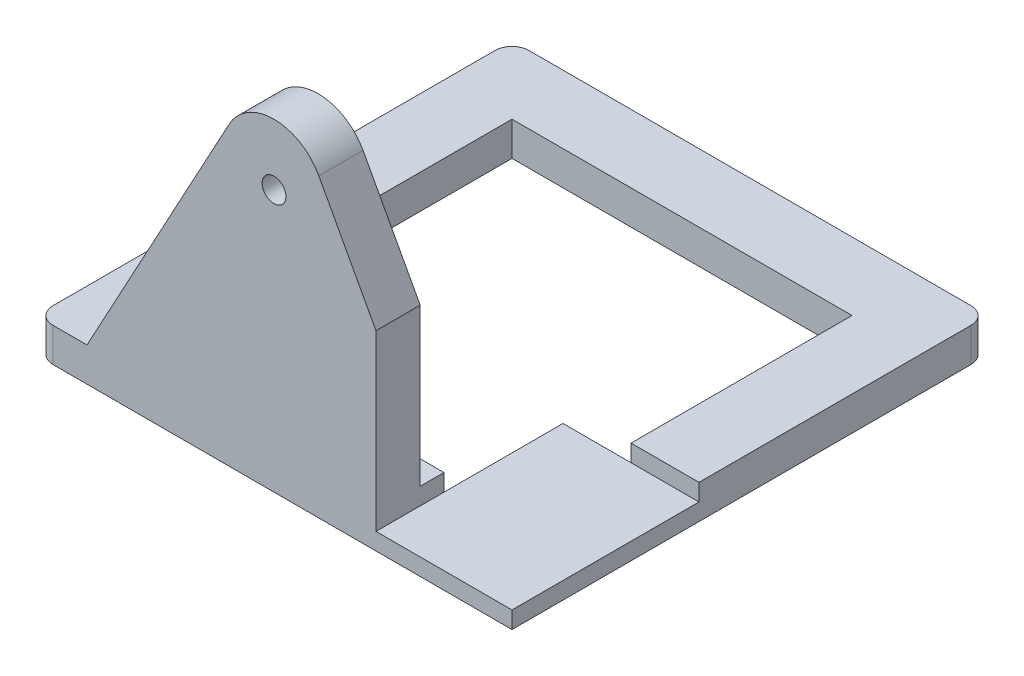
ISO-10303-21;
HEADER;
FILE_DESCRIPTION(('STEP AP214'),'2;1');
FILE_NAME('part.step','',(''),(''),'','','');
FILE_SCHEMA(('AUTOMOTIVE_DESIGN { 1 0 10303 214 1 1 1 1 }'));
ENDSEC;
DATA;
#1=APPLICATION_CONTEXT('core data for automotive mechanical design processes');
#2=APPLICATION_PROTOCOL_DEFINITION('international standard','automotive_design',2000,#1);
#3=PRODUCT_CONTEXT('',#1,'mechanical');
#4=PRODUCT('Part','Part','',(#3));
#5=PRODUCT_RELATED_PRODUCT_CATEGORY('part','',(#4));
#6=PRODUCT_DEFINITION_FORMATION('','',#4);
#7=PRODUCT_DEFINITION_CONTEXT('part definition',#1,'design');
#8=PRODUCT_DEFINITION('design','',#6,#7);
#9=PRODUCT_DEFINITION_SHAPE('','',#8);
#10=(LENGTH_UNIT() NAMED_UNIT(*) SI_UNIT(.MILLI.,.METRE.));
#11=(NAMED_UNIT(*) PLANE_ANGLE_UNIT() SI_UNIT($,.RADIAN.));
#12=(NAMED_UNIT(*) SI_UNIT($,.STERADIAN.) SOLID_ANGLE_UNIT());
#13=UNCERTAINTY_MEASURE_WITH_UNIT(LENGTH_MEASURE(1.E-05),#10,'distance_accuracy_value','');
#14=(GEOMETRIC_REPRESENTATION_CONTEXT(3) GLOBAL_UNCERTAINTY_ASSIGNED_CONTEXT((#13)) GLOBAL_UNIT_ASSIGNED_CONTEXT((#10,
#11,#12)) REPRESENTATION_CONTEXT('',''));
#15=CARTESIAN_POINT('',(0.,0.,0.));
#16=DIRECTION('',(0.,0.,1.));
#17=DIRECTION('',(1.,0.,0.));
#18=AXIS2_PLACEMENT_3D('',#15,#16,#17);
#19=CARTESIAN_POINT('',(49.9999999999994,10.,49.9999999999998));
#20=DIRECTION('',(-1.,0.,0.));
#21=DIRECTION('',(0.,0.,1.));
#22=AXIS2_PLACEMENT_3D('',#19,#20,#21);
#23=PLANE('',#22);
#24=DIRECTION('',(0.,0.,-1.));
#25=VECTOR('',#24,1.);
#26=CARTESIAN_POINT('',(49.9999999999994,0.,49.9999999999998));
#27=LINE('',#26,#25);
#28=CARTESIAN_POINT('',(49.9999999999994,0.,14.9999999999998));
#29=VERTEX_POINT('',#28);
#30=CARTESIAN_POINT('',(49.9999999999994,0.,-50.0000000000003));
#31=VERTEX_POINT('',#30);
#32=EDGE_CURVE('E278',#29,#31,#27,.T.);
#33=ORIENTED_EDGE('',*,*,#32,.F.);
#34=DIRECTION('',(0.,1.,0.));
#35=VECTOR('',#34,1.);
#36=CARTESIAN_POINT('',(49.9999999999994,10.,14.9999999999998));
#37=LINE('',#36,#35);
#38=CARTESIAN_POINT('',(49.9999999999994,5.,14.9999999999998));
#39=VERTEX_POINT('',#38);
#40=EDGE_CURVE('E215',#29,#39,#37,.T.);
#41=ORIENTED_EDGE('',*,*,#40,.T.);
#42=DIRECTION('',(0.,1.,0.));
#43=VECTOR('',#42,1.);
#44=CARTESIAN_POINT('',(49.9999999999994,10.,14.9999999999998));
#45=LINE('',#44,#43);
#46=CARTESIAN_POINT('',(49.9999999999994,10.,14.9999999999998));
#47=VERTEX_POINT('',#46);
#48=EDGE_CURVE('E11',#39,#47,#45,.T.);
#49=ORIENTED_EDGE('',*,*,#48,.T.);
#50=DIRECTION('',(0.,0.,-1.));
#51=VECTOR('',#50,1.);
#52=CARTESIAN_POINT('',(49.9999999999994,10.,49.9999999999998));
#53=LINE('',#52,#51);
#54=CARTESIAN_POINT('',(49.9999999999994,10.,-50.0000000000003));
#55=VERTEX_POINT('',#54);
#56=EDGE_CURVE('E279',#47,#55,#53,.T.);
#57=ORIENTED_EDGE('',*,*,#56,.T.);
#58=DIRECTION('',(0.,-1.,0.));
#59=VECTOR('',#58,1.);
#60=CARTESIAN_POINT('',(49.9999999999994,10.,-50.0000000000003));
#61=LINE('',#60,#59);
#62=EDGE_CURVE('E196',#55,#31,#61,.T.);
#63=ORIENTED_EDGE('',*,*,#62,.T.);
#64=EDGE_LOOP('',(#33,#41,#49,#57,#63));
#65=FACE_BOUND('',#64,.T.);
#66=ADVANCED_FACE('F33',(#65),#23,.T.);
#67=CARTESIAN_POINT('',(-50.0000000000007,10.,49.9999999999998));
#68=DIRECTION('',(0.,0.,-1.));
#69=DIRECTION('',(-1.,0.,0.));
#70=AXIS2_PLACEMENT_3D('',#67,#68,#69);
#71=PLANE('',#70);
#72=DIRECTION('',(0.,-1.,0.));
#73=VECTOR('',#72,1.);
#74=CARTESIAN_POINT('',(29.9999999999996,10.,49.9999999999998));
#75=LINE('',#74,#73);
#76=CARTESIAN_POINT('',(29.9999999999996,10.,49.9999999999998));
#77=VERTEX_POINT('',#76);
#78=CARTESIAN_POINT('',(29.9999999999996,5.,49.9999999999998));
#79=VERTEX_POINT('',#78);
#80=EDGE_CURVE('E236',#77,#79,#75,.T.);
#81=ORIENTED_EDGE('',*,*,#80,.T.);
#82=DIRECTION('',(0.,-1.,0.));
#83=VECTOR('',#82,1.);
#84=CARTESIAN_POINT('',(29.9999999999996,10.,49.9999999999998));
#85=LINE('',#84,#83);
#86=CARTESIAN_POINT('',(29.9999999999996,0.,49.9999999999998));
#87=VERTEX_POINT('',#86);
#88=EDGE_CURVE('E212',#79,#87,#85,.T.);
#89=ORIENTED_EDGE('',*,*,#88,.T.);
#90=DIRECTION('',(1.,0.,0.));
#91=VECTOR('',#90,1.);
#92=CARTESIAN_POINT('',(-50.0000000000007,0.,49.9999999999998));
#93=LINE('',#92,#91);
#94=CARTESIAN_POINT('',(-50.0000000000007,0.,49.9999999999998));
#95=VERTEX_POINT('',#94);
#96=EDGE_CURVE('E282',#95,#87,#93,.T.);
#97=ORIENTED_EDGE('',*,*,#96,.F.);
#98=DIRECTION('',(0.,-1.,0.));
#99=VECTOR('',#98,1.);
#100=CARTESIAN_POINT('',(-50.0000000000007,10.,49.9999999999998));
#101=LINE('',#100,#99);
#102=CARTESIAN_POINT('',(-50.0000000000007,10.,49.9999999999998));
#103=VERTEX_POINT('',#102);
#104=EDGE_CURVE('E290',#103,#95,#101,.T.);
#105=ORIENTED_EDGE('',*,*,#104,.F.);
#106=DIRECTION('',(1.,0.,0.));
#107=VECTOR('',#106,1.);
#108=CARTESIAN_POINT('',(-50.0000000000007,10.,49.9999999999998));
#109=LINE('',#108,#107);
#110=EDGE_CURVE('E287',#103,#77,#109,.T.);
#111=ORIENTED_EDGE('',*,*,#110,.T.);
#112=EDGE_LOOP('',(#81,#89,#97,#105,#111));
#113=FACE_BOUND('',#112,.T.);
#114=ADVANCED_FACE('F404',(#113),#71,.T.);
#115=CARTESIAN_POINT('',(0.,10.,0.));
#116=DIRECTION('',(0.,-1.,0.));
#117=DIRECTION('',(0.,0.,-1.));
#118=AXIS2_PLACEMENT_3D('',#115,#116,#117);
#119=PLANE('',#118);
#120=DIRECTION('',(0.,0.,1.));
#121=VECTOR('',#120,1.);
#122=CARTESIAN_POINT('',(29.9999999999996,10.,0.));
#123=LINE('',#122,#121);
#124=CARTESIAN_POINT('',(29.9999999999996,9.99999999999998,56.9999999999998));
#125=VERTEX_POINT('',#124);
#126=EDGE_CURVE('E234',#77,#125,#123,.T.);
#127=ORIENTED_EDGE('',*,*,#126,.F.);
#128=ORIENTED_EDGE('',*,*,#110,.F.);
#129=DIRECTION('',(0.,0.,1.));
#130=VECTOR('',#129,1.);
#131=CARTESIAN_POINT('',(-50.0000000000007,10.,49.9999999999998));
#132=LINE('',#131,#130);
#133=CARTESIAN_POINT('',(-50.0000000000007,10.,-50.0000000000003));
#134=VERTEX_POINT('',#133);
#135=EDGE_CURVE('E284',#134,#103,#132,.T.);
#136=ORIENTED_EDGE('',*,*,#135,.F.);
#137=DIRECTION('',(-1.,0.,0.));
#138=VECTOR('',#137,1.);
#139=CARTESIAN_POINT('',(-50.0000000000007,10.,-50.0000000000003));
#140=LINE('',#139,#138);
#141=EDGE_CURVE('E281',#55,#134,#140,.T.);
#142=ORIENTED_EDGE('',*,*,#141,.F.);
#143=ORIENTED_EDGE('',*,*,#56,.F.);
#144=DIRECTION('',(-1.,0.,0.));
#145=VECTOR('',#144,1.);
#146=CARTESIAN_POINT('',(0.,10.,14.9999999999998));
#147=LINE('',#146,#145);
#148=CARTESIAN_POINT('',(69.9999999999996,10.,14.9999999999998));
#149=VERTEX_POINT('',#148);
#150=EDGE_CURVE('E239',#149,#47,#147,.T.);
#151=ORIENTED_EDGE('',*,*,#150,.F.);
#152=DIRECTION('',(0.,0.,-1.));
#153=VECTOR('',#152,1.);
#154=CARTESIAN_POINT('',(69.9999999999996,10.,69.9999999999998));
#155=LINE('',#154,#153);
#156=CARTESIAN_POINT('',(69.9999999999996,10.,-65.0000000000002));
#157=VERTEX_POINT('',#156);
#158=EDGE_CURVE('E184',#149,#157,#155,.T.);
#159=ORIENTED_EDGE('',*,*,#158,.T.);
#160=CARTESIAN_POINT('',(64.9999999999996,10.,-65.0000000000002));
#161=DIRECTION('',(0.,-1.,0.));
#162=DIRECTION('',(0.,0.,-1.));
#163=AXIS2_PLACEMENT_3D('',#160,#161,#162);
#164=CIRCLE('',#163,5.);
#165=CARTESIAN_POINT('',(64.9999999999996,10.,-70.0000000000002));
#166=VERTEX_POINT('',#165);
#167=EDGE_CURVE('E330',#157,#166,#164,.F.);
#168=ORIENTED_EDGE('',*,*,#167,.T.);
#169=DIRECTION('',(-1.,0.,0.));
#170=VECTOR('',#169,1.);
#171=CARTESIAN_POINT('',(-70.0000000000005,10.,-70.0000000000002));
#172=LINE('',#171,#170);
#173=CARTESIAN_POINT('',(-65.0000000000005,10.,-70.0000000000002));
#174=VERTEX_POINT('',#173);
#175=EDGE_CURVE('E306',#166,#174,#172,.T.);
#176=ORIENTED_EDGE('',*,*,#175,.T.);
#177=CARTESIAN_POINT('',(-65.0000000000005,10.,-65.0000000000002));
#178=DIRECTION('',(0.,-1.,0.));
#179=DIRECTION('',(0.,0.,-1.));
#180=AXIS2_PLACEMENT_3D('',#177,#178,#179);
#181=CIRCLE('',#180,5.);
#182=CARTESIAN_POINT('',(-70.0000000000005,10.,-65.0000000000002));
#183=VERTEX_POINT('',#182);
#184=EDGE_CURVE('E55',#174,#183,#181,.F.);
#185=ORIENTED_EDGE('',*,*,#184,.T.);
#186=DIRECTION('',(0.,0.,1.));
#187=VECTOR('',#186,1.);
#188=CARTESIAN_POINT('',(-70.0000000000005,10.,69.9999999999998));
#189=LINE('',#188,#187);
#190=CARTESIAN_POINT('',(-70.0000000000005,10.,64.9999999999998));
#191=VERTEX_POINT('',#190);
#192=EDGE_CURVE('E308',#183,#191,#189,.T.);
#193=ORIENTED_EDGE('',*,*,#192,.T.);
#194=CARTESIAN_POINT('',(-65.0000000000005,10.,64.9999999999998));
#195=DIRECTION('',(0.,-1.,0.));
#196=DIRECTION('',(0.,0.,-1.));
#197=AXIS2_PLACEMENT_3D('',#194,#195,#196);
#198=CIRCLE('',#197,5.);
#199=CARTESIAN_POINT('',(-65.0000000000005,10.,69.9999999999998));
#200=VERTEX_POINT('',#199);
#201=EDGE_CURVE('E328',#191,#200,#198,.F.);
#202=ORIENTED_EDGE('',*,*,#201,.T.);
#203=DIRECTION('',(1.,0.,0.));
#204=VECTOR('',#203,1.);
#205=CARTESIAN_POINT('',(-70.0000000000005,10.,69.9999999999998));
#206=LINE('',#205,#204);
#207=CARTESIAN_POINT('',(-55.,10.,69.9999999999998));
#208=VERTEX_POINT('',#207);
#209=EDGE_CURVE('E310',#200,#208,#206,.T.);
#210=ORIENTED_EDGE('',*,*,#209,.T.);
#211=DIRECTION('',(0.,0.,-1.));
#212=VECTOR('',#211,1.);
#213=CARTESIAN_POINT('',(-55.,9.99999999999998,209.014387744578));
#214=LINE('',#213,#212);
#215=CARTESIAN_POINT('',(-55.,9.99999999999998,56.9999999999998));
#216=VERTEX_POINT('',#215);
#217=EDGE_CURVE('E268',#208,#216,#214,.T.);
#218=ORIENTED_EDGE('',*,*,#217,.T.);
#219=DIRECTION('',(-1.,0.,0.));
#220=VECTOR('',#219,1.);
#221=CARTESIAN_POINT('',(-55.,9.99999999999998,56.9999999999998));
#222=LINE('',#221,#220);
#223=EDGE_CURVE('E262',#125,#216,#222,.T.);
#224=ORIENTED_EDGE('',*,*,#223,.F.);
#225=EDGE_LOOP('',(#127,#128,#136,#142,#143,#151,#159,#168,#176,#185,#193,#202,#210,#218,#224));
#226=FACE_BOUND('',#225,.T.);
#227=ADVANCED_FACE('F359',(#226),#119,.F.);
#228=CARTESIAN_POINT('',(69.9999999999996,10.,69.9999999999998));
#229=DIRECTION('',(-1.,0.,0.));
#230=DIRECTION('',(0.,0.,1.));
#231=AXIS2_PLACEMENT_3D('',#228,#229,#230);
#232=PLANE('',#231);
#233=DIRECTION('',(0.,0.,-1.));
#234=VECTOR('',#233,1.);
#235=CARTESIAN_POINT('',(69.9999999999996,0.,69.9999999999998));
#236=LINE('',#235,#234);
#237=CARTESIAN_POINT('',(69.9999999999996,0.,69.9999999999998));
#238=VERTEX_POINT('',#237);
#239=CARTESIAN_POINT('',(69.9999999999996,0.,-65.0000000000002));
#240=VERTEX_POINT('',#239);
#241=EDGE_CURVE('E188',#238,#240,#236,.T.);
#242=ORIENTED_EDGE('',*,*,#241,.T.);
#243=DIRECTION('',(0.,-1.,0.));
#244=VECTOR('',#243,1.);
#245=CARTESIAN_POINT('',(69.9999999999996,10.,-65.0000000000002));
#246=LINE('',#245,#244);
#247=EDGE_CURVE('E325',#240,#157,#246,.F.);
#248=ORIENTED_EDGE('',*,*,#247,.T.);
#249=ORIENTED_EDGE('',*,*,#158,.F.);
#250=DIRECTION('',(0.,-1.,0.));
#251=VECTOR('',#250,1.);
#252=CARTESIAN_POINT('',(69.9999999999996,95.,14.9999999999998));
#253=LINE('',#252,#251);
#254=CARTESIAN_POINT('',(69.9999999999996,5.,14.9999999999998));
#255=VERTEX_POINT('',#254);
#256=EDGE_CURVE('E227',#149,#255,#253,.T.);
#257=ORIENTED_EDGE('',*,*,#256,.T.);
#258=DIRECTION('',(0.,0.,-1.));
#259=VECTOR('',#258,1.);
#260=CARTESIAN_POINT('',(69.9999999999996,5.,69.9999999999998));
#261=LINE('',#260,#259);
#262=CARTESIAN_POINT('',(69.9999999999996,5.,69.9999999999998));
#263=VERTEX_POINT('',#262);
#264=EDGE_CURVE('E200',#263,#255,#261,.T.);
#265=ORIENTED_EDGE('',*,*,#264,.F.);
#266=DIRECTION('',(0.,-1.,0.));
#267=VECTOR('',#266,1.);
#268=CARTESIAN_POINT('',(69.9999999999996,73.0073525436772,69.9999999999998));
#269=LINE('',#268,#267);
#270=EDGE_CURVE('E179',#263,#238,#269,.T.);
#271=ORIENTED_EDGE('',*,*,#270,.T.);
#272=EDGE_LOOP('',(#242,#248,#249,#257,#265,#271));
#273=FACE_BOUND('',#272,.T.);
#274=ADVANCED_FACE('F198',(#273),#232,.F.);
#275=CARTESIAN_POINT('',(-70.0000000000005,10.,69.9999999999998));
#276=DIRECTION('',(0.,0.,-1.));
#277=DIRECTION('',(-1.,0.,0.));
#278=AXIS2_PLACEMENT_3D('',#275,#276,#277);
#279=PLANE('',#278);
#280=DIRECTION('',(1.,0.,0.));
#281=VECTOR('',#280,1.);
#282=CARTESIAN_POINT('',(29.9999999999996,5.,69.9999999999998));
#283=LINE('',#282,#281);
#284=CARTESIAN_POINT('',(29.9999999999996,5.,69.9999999999998));
#285=VERTEX_POINT('',#284);
#286=EDGE_CURVE('E221',#285,#263,#283,.T.);
#287=ORIENTED_EDGE('',*,*,#286,.F.);
#288=DIRECTION('',(0.,-1.,0.));
#289=VECTOR('',#288,1.);
#290=CARTESIAN_POINT('',(29.9999999999996,95.,69.9999999999998));
#291=LINE('',#290,#289);
#292=CARTESIAN_POINT('',(29.9999999999996,56.127184447401,69.9999999999998));
#293=VERTEX_POINT('',#292);
#294=EDGE_CURVE('E229',#293,#285,#291,.T.);
#295=ORIENTED_EDGE('',*,*,#294,.F.);
#296=DIRECTION('',(-0.476495951175479,0.879176665132427,0.));
#297=VECTOR('',#296,1.);
#298=CARTESIAN_POINT('',(55.,9.99999999999998,69.9999999999998));
#299=LINE('',#298,#297);
#300=CARTESIAN_POINT('',(13.1876499769864,87.1474392676322,69.9999999999998));
#301=VERTEX_POINT('',#300);
#302=EDGE_CURVE('E265',#293,#301,#299,.T.);
#303=ORIENTED_EDGE('',*,*,#302,.T.);
#304=CARTESIAN_POINT('',(0.,80.,69.9999999999998));
#305=DIRECTION('',(0.,0.,-1.));
#306=DIRECTION('',(-1.,0.,0.));
#307=AXIS2_PLACEMENT_3D('',#304,#305,#306);
#308=CIRCLE('',#307,15.);
#309=CARTESIAN_POINT('',(-13.1876499769864,87.1474392676322,69.9999999999998));
#310=VERTEX_POINT('',#309);
#311=EDGE_CURVE('E271',#301,#310,#308,.F.);
#312=ORIENTED_EDGE('',*,*,#311,.T.);
#313=DIRECTION('',(-0.476495951175479,-0.879176665132427,0.));
#314=VECTOR('',#313,1.);
#315=CARTESIAN_POINT('',(-55.,9.99999999999998,69.9999999999998));
#316=LINE('',#315,#314);
#317=EDGE_CURVE('E267',#310,#208,#316,.T.);
#318=ORIENTED_EDGE('',*,*,#317,.T.);
#319=ORIENTED_EDGE('',*,*,#209,.F.);
#320=DIRECTION('',(0.,-1.,0.));
#321=VECTOR('',#320,1.);
#322=CARTESIAN_POINT('',(-65.0000000000005,10.,69.9999999999998));
#323=LINE('',#322,#321);
#324=CARTESIAN_POINT('',(-65.0000000000005,0.,69.9999999999998));
#325=VERTEX_POINT('',#324);
#326=EDGE_CURVE('E182',#200,#325,#323,.T.);
#327=ORIENTED_EDGE('',*,*,#326,.T.);
#328=DIRECTION('',(1.,0.,0.));
#329=VECTOR('',#328,1.);
#330=CARTESIAN_POINT('',(-70.0000000000005,0.,69.9999999999998));
#331=LINE('',#330,#329);
#332=EDGE_CURVE('E173',#325,#238,#331,.T.);
#333=ORIENTED_EDGE('',*,*,#332,.T.);
#334=ORIENTED_EDGE('',*,*,#270,.F.);
#335=EDGE_LOOP('',(#287,#295,#303,#312,#318,#319,#327,#333,#334));
#336=FACE_BOUND('',#335,.T.);
#337=CARTESIAN_POINT('',(0.,77.,69.9999999999998));
#338=DIRECTION('',(0.,0.,-1.));
#339=DIRECTION('',(-1.,0.,0.));
#340=AXIS2_PLACEMENT_3D('',#337,#338,#339);
#341=CIRCLE('',#340,3.5);
#342=CARTESIAN_POINT('',(-3.5,77.,69.9999999999998));
#343=VERTEX_POINT('',#342);
#344=EDGE_CURVE('E242',#343,#343,#341,.T.);
#345=ORIENTED_EDGE('',*,*,#344,.T.);
#346=EDGE_LOOP('',(#345));
#347=FACE_BOUND('',#346,.T.);
#348=ADVANCED_FACE('F176',(#336,#347),#279,.F.);
#349=CARTESIAN_POINT('',(55.,9.99999999999998,209.014387744578));
#350=DIRECTION('',(0.879176665132427,0.476495951175478,0.));
#351=DIRECTION('',(-0.476495951175479,0.879176665132427,0.));
#352=AXIS2_PLACEMENT_3D('',#349,#350,#351);
#353=PLANE('',#352);
#354=ORIENTED_EDGE('',*,*,#302,.F.);
#355=DIRECTION('',(0.,0.,-1.));
#356=VECTOR('',#355,1.);
#357=CARTESIAN_POINT('',(29.9999999999996,56.1271844474009,209.014387744578));
#358=LINE('',#357,#356);
#359=CARTESIAN_POINT('',(29.9999999999996,56.1271844474009,56.9999999999998));
#360=VERTEX_POINT('',#359);
#361=EDGE_CURVE('E231',#293,#360,#358,.T.);
#362=ORIENTED_EDGE('',*,*,#361,.T.);
#363=DIRECTION('',(0.476495951175479,-0.879176665132427,0.));
#364=VECTOR('',#363,1.);
#365=CARTESIAN_POINT('',(55.,9.99999999999998,56.9999999999998));
#366=LINE('',#365,#364);
#367=CARTESIAN_POINT('',(13.1876499769864,87.1474392676322,56.9999999999998));
#368=VERTEX_POINT('',#367);
#369=EDGE_CURVE('E259',#368,#360,#366,.T.);
#370=ORIENTED_EDGE('',*,*,#369,.F.);
#371=DIRECTION('',(0.,0.,-1.));
#372=VECTOR('',#371,1.);
#373=CARTESIAN_POINT('',(13.1876499769864,87.1474392676322,209.014387744578));
#374=LINE('',#373,#372);
#375=EDGE_CURVE('E274',#301,#368,#374,.T.);
#376=ORIENTED_EDGE('',*,*,#375,.F.);
#377=EDGE_LOOP('',(#354,#362,#370,#376));
#378=FACE_BOUND('',#377,.T.);
#379=ADVANCED_FACE('F346',(#378),#353,.T.);
#380=CARTESIAN_POINT('',(0.,80.,56.9999999999998));
#381=DIRECTION('',(0.,0.,1.));
#382=DIRECTION('',(1.,0.,0.));
#383=AXIS2_PLACEMENT_3D('',#380,#381,#382);
#384=PLANE('',#383);
#385=CARTESIAN_POINT('',(0.,77.,56.9999999999998));
#386=DIRECTION('',(0.,0.,-1.));
#387=DIRECTION('',(-1.,0.,0.));
#388=AXIS2_PLACEMENT_3D('',#385,#386,#387);
#389=CIRCLE('',#388,8.55);
#390=CARTESIAN_POINT('',(-8.55,77.,56.9999999999998));
#391=VERTEX_POINT('',#390);
#392=EDGE_CURVE('E245',#391,#391,#389,.T.);
#393=ORIENTED_EDGE('',*,*,#392,.F.);
#394=EDGE_LOOP('',(#393));
#395=FACE_BOUND('',#394,.T.);
#396=DIRECTION('',(0.,1.,0.));
#397=VECTOR('',#396,1.);
#398=CARTESIAN_POINT('',(29.9999999999996,80.,56.9999999999998));
#399=LINE('',#398,#397);
#400=EDGE_CURVE('E41',#125,#360,#399,.T.);
#401=ORIENTED_EDGE('',*,*,#400,.F.);
#402=ORIENTED_EDGE('',*,*,#223,.T.);
#403=DIRECTION('',(0.476495951175479,0.879176665132427,0.));
#404=VECTOR('',#403,1.);
#405=CARTESIAN_POINT('',(-55.,9.99999999999998,56.9999999999998));
#406=LINE('',#405,#404);
#407=CARTESIAN_POINT('',(-13.1876499769864,87.1474392676322,56.9999999999998));
#408=VERTEX_POINT('',#407);
#409=EDGE_CURVE('E251',#216,#408,#406,.T.);
#410=ORIENTED_EDGE('',*,*,#409,.T.);
#411=CARTESIAN_POINT('',(0.,80.,56.9999999999998));
#412=DIRECTION('',(0.,0.,-1.));
#413=DIRECTION('',(1.,0.,0.));
#414=AXIS2_PLACEMENT_3D('',#411,#412,#413);
#415=CIRCLE('',#414,15.);
#416=EDGE_CURVE('E256',#408,#368,#415,.T.);
#417=ORIENTED_EDGE('',*,*,#416,.T.);
#418=ORIENTED_EDGE('',*,*,#369,.T.);
#419=EDGE_LOOP('',(#401,#402,#410,#417,#418));
#420=FACE_BOUND('',#419,.T.);
#421=ADVANCED_FACE('F348',(#395,#420),#384,.F.);
#422=CARTESIAN_POINT('',(0.,0.,0.));
#423=DIRECTION('',(0.,-1.,0.));
#424=DIRECTION('',(0.,0.,-1.));
#425=AXIS2_PLACEMENT_3D('',#422,#423,#424);
#426=PLANE('',#425);
#427=DIRECTION('',(-1.,0.,0.));
#428=VECTOR('',#427,1.);
#429=CARTESIAN_POINT('',(29.9999999999996,0.,14.9999999999998));
#430=LINE('',#429,#428);
#431=CARTESIAN_POINT('',(29.9999999999996,0.,14.9999999999998));
#432=VERTEX_POINT('',#431);
#433=EDGE_CURVE('E208',#29,#432,#430,.T.);
#434=ORIENTED_EDGE('',*,*,#433,.F.);
#435=ORIENTED_EDGE('',*,*,#32,.T.);
#436=DIRECTION('',(-1.,0.,0.));
#437=VECTOR('',#436,1.);
#438=CARTESIAN_POINT('',(-50.0000000000007,0.,-50.0000000000003));
#439=LINE('',#438,#437);
#440=CARTESIAN_POINT('',(-50.0000000000007,0.,-50.0000000000003));
#441=VERTEX_POINT('',#440);
#442=EDGE_CURVE('E292',#31,#441,#439,.T.);
#443=ORIENTED_EDGE('',*,*,#442,.T.);
#444=DIRECTION('',(0.,0.,1.));
#445=VECTOR('',#444,1.);
#446=CARTESIAN_POINT('',(-50.0000000000007,0.,49.9999999999998));
#447=LINE('',#446,#445);
#448=EDGE_CURVE('E295',#441,#95,#447,.T.);
#449=ORIENTED_EDGE('',*,*,#448,.T.);
#450=ORIENTED_EDGE('',*,*,#96,.T.);
#451=DIRECTION('',(0.,0.,1.));
#452=VECTOR('',#451,1.);
#453=CARTESIAN_POINT('',(29.9999999999996,0.,69.9999999999998));
#454=LINE('',#453,#452);
#455=EDGE_CURVE('E394',#432,#87,#454,.T.);
#456=ORIENTED_EDGE('',*,*,#455,.F.);
#457=EDGE_LOOP('',(#434,#435,#443,#449,#450,#456));
#458=FACE_BOUND('',#457,.T.);
#459=CARTESIAN_POINT('',(64.9999999999996,0.,-65.0000000000002));
#460=DIRECTION('',(0.,-1.,0.));
#461=DIRECTION('',(0.,0.,-1.));
#462=AXIS2_PLACEMENT_3D('',#459,#460,#461);
#463=CIRCLE('',#462,5.);
#464=CARTESIAN_POINT('',(64.9999999999996,0.,-70.0000000000002));
#465=VERTEX_POINT('',#464);
#466=EDGE_CURVE('E191',#465,#240,#463,.T.);
#467=ORIENTED_EDGE('',*,*,#466,.T.);
#468=ORIENTED_EDGE('',*,*,#241,.F.);
#469=ORIENTED_EDGE('',*,*,#332,.F.);
#470=CARTESIAN_POINT('',(-65.0000000000005,0.,64.9999999999998));
#471=DIRECTION('',(0.,-1.,0.));
#472=DIRECTION('',(0.,0.,-1.));
#473=AXIS2_PLACEMENT_3D('',#470,#471,#472);
#474=CIRCLE('',#473,5.);
#475=CARTESIAN_POINT('',(-70.0000000000005,0.,64.9999999999998));
#476=VERTEX_POINT('',#475);
#477=EDGE_CURVE('E322',#325,#476,#474,.T.);
#478=ORIENTED_EDGE('',*,*,#477,.T.);
#479=DIRECTION('',(0.,0.,1.));
#480=VECTOR('',#479,1.);
#481=CARTESIAN_POINT('',(-70.0000000000005,0.,69.9999999999998));
#482=LINE('',#481,#480);
#483=CARTESIAN_POINT('',(-70.0000000000005,0.,-65.0000000000002));
#484=VERTEX_POINT('',#483);
#485=EDGE_CURVE('E185',#484,#476,#482,.T.);
#486=ORIENTED_EDGE('',*,*,#485,.F.);
#487=CARTESIAN_POINT('',(-65.0000000000005,0.,-65.0000000000002));
#488=DIRECTION('',(0.,-1.,0.));
#489=DIRECTION('',(0.,0.,-1.));
#490=AXIS2_PLACEMENT_3D('',#487,#488,#489);
#491=CIRCLE('',#490,5.);
#492=CARTESIAN_POINT('',(-65.0000000000005,0.,-70.0000000000002));
#493=VERTEX_POINT('',#492);
#494=EDGE_CURVE('E320',#484,#493,#491,.T.);
#495=ORIENTED_EDGE('',*,*,#494,.T.);
#496=DIRECTION('',(-1.,0.,0.));
#497=VECTOR('',#496,1.);
#498=CARTESIAN_POINT('',(-70.0000000000005,0.,-70.0000000000002));
#499=LINE('',#498,#497);
#500=EDGE_CURVE('E195',#465,#493,#499,.T.);
#501=ORIENTED_EDGE('',*,*,#500,.F.);
#502=EDGE_LOOP('',(#467,#468,#469,#478,#486,#495,#501));
#503=FACE_BOUND('',#502,.T.);
#504=ADVANCED_FACE('F189',(#458,#503),#426,.T.);
#505=CARTESIAN_POINT('',(-70.0000000000005,10.,-70.0000000000002));
#506=DIRECTION('',(0.,0.,1.));
#507=DIRECTION('',(1.,0.,0.));
#508=AXIS2_PLACEMENT_3D('',#505,#506,#507);
#509=PLANE('',#508);
#510=ORIENTED_EDGE('',*,*,#175,.F.);
#511=DIRECTION('',(0.,-1.,0.));
#512=VECTOR('',#511,1.);
#513=CARTESIAN_POINT('',(64.9999999999996,10.,-70.0000000000002));
#514=LINE('',#513,#512);
#515=EDGE_CURVE('E317',#166,#465,#514,.T.);
#516=ORIENTED_EDGE('',*,*,#515,.T.);
#517=ORIENTED_EDGE('',*,*,#500,.T.);
#518=DIRECTION('',(0.,-1.,0.));
#519=VECTOR('',#518,1.);
#520=CARTESIAN_POINT('',(-65.0000000000005,10.,-70.0000000000002));
#521=LINE('',#520,#519);
#522=EDGE_CURVE('E311',#493,#174,#521,.F.);
#523=ORIENTED_EDGE('',*,*,#522,.T.);
#524=EDGE_LOOP('',(#510,#516,#517,#523));
#525=FACE_BOUND('',#524,.T.);
#526=ADVANCED_FACE('F370',(#525),#509,.F.);
#527=CARTESIAN_POINT('',(-70.0000000000005,10.,69.9999999999998));
#528=DIRECTION('',(1.,0.,0.));
#529=DIRECTION('',(0.,0.,-1.));
#530=AXIS2_PLACEMENT_3D('',#527,#528,#529);
#531=PLANE('',#530);
#532=ORIENTED_EDGE('',*,*,#485,.T.);
#533=DIRECTION('',(0.,-1.,0.));
#534=VECTOR('',#533,1.);
#535=CARTESIAN_POINT('',(-70.0000000000005,10.,64.9999999999998));
#536=LINE('',#535,#534);
#537=EDGE_CURVE('E48',#476,#191,#536,.F.);
#538=ORIENTED_EDGE('',*,*,#537,.T.);
#539=ORIENTED_EDGE('',*,*,#192,.F.);
#540=DIRECTION('',(0.,-1.,0.));
#541=VECTOR('',#540,1.);
#542=CARTESIAN_POINT('',(-70.0000000000005,10.,-65.0000000000002));
#543=LINE('',#542,#541);
#544=EDGE_CURVE('E333',#183,#484,#543,.T.);
#545=ORIENTED_EDGE('',*,*,#544,.T.);
#546=EDGE_LOOP('',(#532,#538,#539,#545));
#547=FACE_BOUND('',#546,.T.);
#548=ADVANCED_FACE('F364',(#547),#531,.F.);
#549=CARTESIAN_POINT('',(-50.0000000000007,10.,-50.0000000000003));
#550=DIRECTION('',(0.,0.,1.));
#551=DIRECTION('',(1.,0.,0.));
#552=AXIS2_PLACEMENT_3D('',#549,#550,#551);
#553=PLANE('',#552);
#554=ORIENTED_EDGE('',*,*,#442,.F.);
#555=ORIENTED_EDGE('',*,*,#62,.F.);
#556=ORIENTED_EDGE('',*,*,#141,.T.);
#557=DIRECTION('',(0.,-1.,0.));
#558=VECTOR('',#557,1.);
#559=CARTESIAN_POINT('',(-50.0000000000007,10.,-50.0000000000003));
#560=LINE('',#559,#558);
#561=EDGE_CURVE('E301',#134,#441,#560,.T.);
#562=ORIENTED_EDGE('',*,*,#561,.T.);
#563=EDGE_LOOP('',(#554,#555,#556,#562));
#564=FACE_BOUND('',#563,.T.);
#565=ADVANCED_FACE('F413',(#564),#553,.T.);
#566=CARTESIAN_POINT('',(-50.0000000000007,10.,49.9999999999998));
#567=DIRECTION('',(1.,0.,0.));
#568=DIRECTION('',(0.,0.,-1.));
#569=AXIS2_PLACEMENT_3D('',#566,#567,#568);
#570=PLANE('',#569);
#571=ORIENTED_EDGE('',*,*,#448,.F.);
#572=ORIENTED_EDGE('',*,*,#561,.F.);
#573=ORIENTED_EDGE('',*,*,#135,.T.);
#574=ORIENTED_EDGE('',*,*,#104,.T.);
#575=EDGE_LOOP('',(#571,#572,#573,#574));
#576=FACE_BOUND('',#575,.T.);
#577=ADVANCED_FACE('F411',(#576),#570,.T.);
#578=CARTESIAN_POINT('',(-55.,9.99999999999998,209.014387744578));
#579=DIRECTION('',(-0.879176665132427,0.476495951175478,0.));
#580=DIRECTION('',(-0.476495951175479,-0.879176665132427,0.));
#581=AXIS2_PLACEMENT_3D('',#578,#579,#580);
#582=PLANE('',#581);
#583=ORIENTED_EDGE('',*,*,#317,.F.);
#584=DIRECTION('',(0.,0.,-1.));
#585=VECTOR('',#584,1.);
#586=CARTESIAN_POINT('',(-13.1876499769864,87.1474392676322,209.014387744578));
#587=LINE('',#586,#585);
#588=EDGE_CURVE('E264',#310,#408,#587,.T.);
#589=ORIENTED_EDGE('',*,*,#588,.T.);
#590=ORIENTED_EDGE('',*,*,#409,.F.);
#591=ORIENTED_EDGE('',*,*,#217,.F.);
#592=EDGE_LOOP('',(#583,#589,#590,#591));
#593=FACE_BOUND('',#592,.T.);
#594=ADVANCED_FACE('F358',(#593),#582,.T.);
#595=CARTESIAN_POINT('',(0.,80.,209.014387744578));
#596=DIRECTION('',(0.,0.,-1.));
#597=DIRECTION('',(-1.,0.,0.));
#598=AXIS2_PLACEMENT_3D('',#595,#596,#597);
#599=CYLINDRICAL_SURFACE('',#598,15.);
#600=ORIENTED_EDGE('',*,*,#311,.F.);
#601=ORIENTED_EDGE('',*,*,#375,.T.);
#602=ORIENTED_EDGE('',*,*,#416,.F.);
#603=ORIENTED_EDGE('',*,*,#588,.F.);
#604=EDGE_LOOP('',(#600,#601,#602,#603));
#605=FACE_BOUND('',#604,.T.);
#606=ADVANCED_FACE('F354',(#605),#599,.T.);
#607=CARTESIAN_POINT('',(0.,77.,62.9999999999998));
#608=DIRECTION('',(0.,0.,-1.));
#609=DIRECTION('',(-1.,0.,0.));
#610=AXIS2_PLACEMENT_3D('',#607,#608,#609);
#611=CYLINDRICAL_SURFACE('',#610,8.55);
#612=CARTESIAN_POINT('',(0.,77.,62.9999999999998));
#613=DIRECTION('',(0.,0.,-1.));
#614=DIRECTION('',(-1.,0.,0.));
#615=AXIS2_PLACEMENT_3D('',#612,#613,#614);
#616=CIRCLE('',#615,8.55);
#617=CARTESIAN_POINT('',(-8.55,77.,62.9999999999998));
#618=VERTEX_POINT('',#617);
#619=EDGE_CURVE('E248',#618,#618,#616,.T.);
#620=ORIENTED_EDGE('',*,*,#619,.F.);
#621=EDGE_LOOP('',(#620));
#622=FACE_BOUND('',#621,.T.);
#623=ORIENTED_EDGE('',*,*,#392,.T.);
#624=EDGE_LOOP('',(#623));
#625=FACE_BOUND('',#624,.T.);
#626=ADVANCED_FACE('F462',(#622,#625),#611,.F.);
#627=CARTESIAN_POINT('',(0.,77.,62.9999999999998));
#628=DIRECTION('',(0.,0.,-1.));
#629=DIRECTION('',(-1.,0.,0.));
#630=AXIS2_PLACEMENT_3D('',#627,#628,#629);
#631=PLANE('',#630);
#632=CARTESIAN_POINT('',(0.,77.,62.9999999999998));
#633=DIRECTION('',(0.,0.,-1.));
#634=DIRECTION('',(-1.,0.,0.));
#635=AXIS2_PLACEMENT_3D('',#632,#633,#634);
#636=CIRCLE('',#635,3.5);
#637=CARTESIAN_POINT('',(-3.5,77.,62.9999999999998));
#638=VERTEX_POINT('',#637);
#639=EDGE_CURVE('E241',#638,#638,#636,.T.);
#640=ORIENTED_EDGE('',*,*,#639,.F.);
#641=EDGE_LOOP('',(#640));
#642=FACE_BOUND('',#641,.T.);
#643=ORIENTED_EDGE('',*,*,#619,.T.);
#644=EDGE_LOOP('',(#643));
#645=FACE_BOUND('',#644,.T.);
#646=ADVANCED_FACE('F458',(#642,#645),#631,.T.);
#647=CARTESIAN_POINT('',(0.,77.,69.9999999999998));
#648=DIRECTION('',(0.,0.,-1.));
#649=DIRECTION('',(-1.,0.,0.));
#650=AXIS2_PLACEMENT_3D('',#647,#648,#649);
#651=CYLINDRICAL_SURFACE('',#650,3.5);
#652=CARTESIAN_POINT('',(-3.5,77.,69.9999999999998));
#653=CARTESIAN_POINT('',(-3.5,77.,69.9270833333331));
#654=CARTESIAN_POINT('',(-3.5,77.,69.8541666666665));
#655=CARTESIAN_POINT('',(-3.5,77.,69.7083333333331));
#656=CARTESIAN_POINT('',(-3.5,77.,69.6354166666665));
#657=CARTESIAN_POINT('',(-3.5,77.,69.4895833333331));
#658=CARTESIAN_POINT('',(-3.5,77.,69.4166666666665));
#659=CARTESIAN_POINT('',(-3.5,77.,69.2708333333331));
#660=CARTESIAN_POINT('',(-3.5,77.,69.1979166666665));
#661=CARTESIAN_POINT('',(-3.5,77.,69.0520833333331));
#662=CARTESIAN_POINT('',(-3.5,77.,68.9791666666665));
#663=CARTESIAN_POINT('',(-3.5,77.,68.8333333333331));
#664=CARTESIAN_POINT('',(-3.5,77.,68.7604166666665));
#665=CARTESIAN_POINT('',(-3.5,77.,68.6145833333331));
#666=CARTESIAN_POINT('',(-3.5,77.,68.5416666666665));
#667=CARTESIAN_POINT('',(-3.5,77.,68.3958333333331));
#668=CARTESIAN_POINT('',(-3.5,77.,68.3229166666665));
#669=CARTESIAN_POINT('',(-3.5,77.,68.1770833333331));
#670=CARTESIAN_POINT('',(-3.5,77.,68.1041666666665));
#671=CARTESIAN_POINT('',(-3.5,77.,67.9583333333331));
#672=CARTESIAN_POINT('',(-3.5,77.,67.8854166666665));
#673=CARTESIAN_POINT('',(-3.5,77.,67.7395833333331));
#674=CARTESIAN_POINT('',(-3.5,77.,67.6666666666665));
#675=CARTESIAN_POINT('',(-3.5,77.,67.5208333333331));
#676=CARTESIAN_POINT('',(-3.5,77.,67.4479166666665));
#677=CARTESIAN_POINT('',(-3.5,77.,67.3020833333331));
#678=CARTESIAN_POINT('',(-3.5,77.,67.2291666666665));
#679=CARTESIAN_POINT('',(-3.5,77.,67.0833333333331));
#680=CARTESIAN_POINT('',(-3.5,77.,67.0104166666665));
#681=CARTESIAN_POINT('',(-3.5,77.,66.8645833333331));
#682=CARTESIAN_POINT('',(-3.5,77.,66.7916666666665));
#683=CARTESIAN_POINT('',(-3.5,77.,66.6458333333331));
#684=CARTESIAN_POINT('',(-3.5,77.,66.5729166666665));
#685=CARTESIAN_POINT('',(-3.5,77.,66.4270833333331));
#686=CARTESIAN_POINT('',(-3.5,77.,66.3541666666665));
#687=CARTESIAN_POINT('',(-3.5,77.,66.2083333333331));
#688=CARTESIAN_POINT('',(-3.5,77.,66.1354166666665));
#689=CARTESIAN_POINT('',(-3.5,77.,65.9895833333331));
#690=CARTESIAN_POINT('',(-3.5,77.,65.9166666666665));
#691=CARTESIAN_POINT('',(-3.5,77.,65.7708333333331));
#692=CARTESIAN_POINT('',(-3.5,77.,65.6979166666665));
#693=CARTESIAN_POINT('',(-3.5,77.,65.5520833333331));
#694=CARTESIAN_POINT('',(-3.5,77.,65.4791666666665));
#695=CARTESIAN_POINT('',(-3.5,77.,65.3333333333331));
#696=CARTESIAN_POINT('',(-3.5,77.,65.2604166666665));
#697=CARTESIAN_POINT('',(-3.5,77.,65.1145833333331));
#698=CARTESIAN_POINT('',(-3.5,77.,65.0416666666665));
#699=CARTESIAN_POINT('',(-3.5,77.,64.8958333333331));
#700=CARTESIAN_POINT('',(-3.5,77.,64.8229166666665));
#701=CARTESIAN_POINT('',(-3.5,77.,64.6770833333331));
#702=CARTESIAN_POINT('',(-3.5,77.,64.6041666666665));
#703=CARTESIAN_POINT('',(-3.5,77.,64.4583333333331));
#704=CARTESIAN_POINT('',(-3.5,77.,64.3854166666665));
#705=CARTESIAN_POINT('',(-3.5,77.,64.2395833333331));
#706=CARTESIAN_POINT('',(-3.5,77.,64.1666666666665));
#707=CARTESIAN_POINT('',(-3.5,77.,64.0208333333331));
#708=CARTESIAN_POINT('',(-3.5,77.,63.9479166666665));
#709=CARTESIAN_POINT('',(-3.5,77.,63.8020833333332));
#710=CARTESIAN_POINT('',(-3.5,77.,63.7291666666665));
#711=CARTESIAN_POINT('',(-3.5,77.,63.5833333333331));
#712=CARTESIAN_POINT('',(-3.5,77.,63.5104166666665));
#713=CARTESIAN_POINT('',(-3.5,77.,63.3645833333331));
#714=CARTESIAN_POINT('',(-3.5,77.,63.2916666666665));
#715=CARTESIAN_POINT('',(-3.5,77.,63.1458333333332));
#716=CARTESIAN_POINT('',(-3.5,77.,63.0729166666665));
#717=CARTESIAN_POINT('',(-3.5,77.,62.9999999999998));
#718=B_SPLINE_CURVE_WITH_KNOTS('',3,(#652,#653,#654,#655,#656,#657,#658,#659,#660,#661,#662,
#663,#664,#665,#666,#667,#668,#669,#670,#671,#672,#673,#674,#675,#676,#677,#678,#679,#680,#681,
#682,#683,#684,#685,#686,#687,#688,#689,#690,#691,#692,#693,#694,#695,#696,#697,#698,#699,#700,
#701,#702,#703,#704,#705,#706,#707,#708,#709,#710,#711,#712,#713,#714,#715,#716,#717),
.UNSPECIFIED.,.F.,.F.,(4,2,2,2,2,2,2,2,2,2,2,2,2,2,2,2,2,2,2,2,2,2,2,2,2,2,2,2,2,2,2,2,4),(0.,
0.218750000000004,0.437500000000007,0.656250000000011,0.875000000000001,1.09375,
1.31250000000001,1.53125,1.75,1.96875000000001,2.1875,2.40625,2.625,2.84374999999999,3.0625,
3.28125,3.49999999999999,3.71874999999999,3.9375,4.15624999999999,4.37499999999999,
4.59374999999999,4.8125,5.03124999999999,5.24999999999999,5.46874999999999,5.68749999999998,
5.90624999999999,6.12499999999999,6.34374999999998,6.56249999999998,6.78124999999999,
6.99999999999998),.UNSPECIFIED.);
#719=EDGE_CURVE('BSEAM440',#343,#638,#718,.T.);
#720=ORIENTED_EDGE('',*,*,#344,.F.);
#721=ORIENTED_EDGE('',*,*,#639,.T.);
#722=ORIENTED_EDGE('',*,*,#719,.T.);
#723=ORIENTED_EDGE('',*,*,#719,.F.);
#724=EDGE_LOOP('',(#720,#722,#721,#723));
#725=FACE_BOUND('',#724,.T.);
#726=ADVANCED_FACE('F440',(#725),#651,.F.);
#727=CARTESIAN_POINT('',(64.9999999999996,10.,-65.0000000000002));
#728=DIRECTION('',(0.,-1.,0.));
#729=DIRECTION('',(0.,0.,-1.));
#730=AXIS2_PLACEMENT_3D('',#727,#728,#729);
#731=CYLINDRICAL_SURFACE('',#730,5.);
#732=ORIENTED_EDGE('',*,*,#167,.F.);
#733=ORIENTED_EDGE('',*,*,#247,.F.);
#734=ORIENTED_EDGE('',*,*,#466,.F.);
#735=ORIENTED_EDGE('',*,*,#515,.F.);
#736=EDGE_LOOP('',(#732,#733,#734,#735));
#737=FACE_BOUND('',#736,.T.);
#738=ADVANCED_FACE('F374',(#737),#731,.T.);
#739=CARTESIAN_POINT('',(-65.0000000000005,10.,64.9999999999998));
#740=DIRECTION('',(0.,-1.,0.));
#741=DIRECTION('',(0.,0.,-1.));
#742=AXIS2_PLACEMENT_3D('',#739,#740,#741);
#743=CYLINDRICAL_SURFACE('',#742,5.);
#744=ORIENTED_EDGE('',*,*,#201,.F.);
#745=ORIENTED_EDGE('',*,*,#537,.F.);
#746=ORIENTED_EDGE('',*,*,#477,.F.);
#747=ORIENTED_EDGE('',*,*,#326,.F.);
#748=EDGE_LOOP('',(#744,#745,#746,#747));
#749=FACE_BOUND('',#748,.T.);
#750=ADVANCED_FACE('F362',(#749),#743,.T.);
#751=CARTESIAN_POINT('',(-65.0000000000005,10.,-65.0000000000002));
#752=DIRECTION('',(0.,-1.,0.));
#753=DIRECTION('',(0.,0.,-1.));
#754=AXIS2_PLACEMENT_3D('',#751,#752,#753);
#755=CYLINDRICAL_SURFACE('',#754,5.);
#756=ORIENTED_EDGE('',*,*,#184,.F.);
#757=ORIENTED_EDGE('',*,*,#522,.F.);
#758=ORIENTED_EDGE('',*,*,#494,.F.);
#759=ORIENTED_EDGE('',*,*,#544,.F.);
#760=EDGE_LOOP('',(#756,#757,#758,#759));
#761=FACE_BOUND('',#760,.T.);
#762=ADVANCED_FACE('F35',(#761),#755,.T.);
#763=CARTESIAN_POINT('',(29.9999999999996,95.,14.9999999999998));
#764=DIRECTION('',(0.,0.,1.));
#765=DIRECTION('',(1.,0.,0.));
#766=AXIS2_PLACEMENT_3D('',#763,#764,#765);
#767=PLANE('',#766);
#768=ORIENTED_EDGE('',*,*,#150,.T.);
#769=ORIENTED_EDGE('',*,*,#48,.F.);
#770=DIRECTION('',(-1.,0.,0.));
#771=VECTOR('',#770,1.);
#772=CARTESIAN_POINT('',(29.9999999999996,5.,14.9999999999998));
#773=LINE('',#772,#771);
#774=EDGE_CURVE('E224',#255,#39,#773,.T.);
#775=ORIENTED_EDGE('',*,*,#774,.F.);
#776=ORIENTED_EDGE('',*,*,#256,.F.);
#777=EDGE_LOOP('',(#768,#769,#775,#776));
#778=FACE_BOUND('',#777,.T.);
#779=ADVANCED_FACE('F381',(#778),#767,.T.);
#780=CARTESIAN_POINT('',(29.9999999999996,95.,69.9999999999998));
#781=DIRECTION('',(1.,0.,0.));
#782=DIRECTION('',(0.,0.,-1.));
#783=AXIS2_PLACEMENT_3D('',#780,#781,#782);
#784=PLANE('',#783);
#785=ORIENTED_EDGE('',*,*,#126,.T.);
#786=ORIENTED_EDGE('',*,*,#400,.T.);
#787=ORIENTED_EDGE('',*,*,#361,.F.);
#788=ORIENTED_EDGE('',*,*,#294,.T.);
#789=DIRECTION('',(0.,0.,1.));
#790=VECTOR('',#789,1.);
#791=CARTESIAN_POINT('',(29.9999999999996,5.,69.9999999999998));
#792=LINE('',#791,#790);
#793=EDGE_CURVE('E218',#79,#285,#792,.T.);
#794=ORIENTED_EDGE('',*,*,#793,.F.);
#795=ORIENTED_EDGE('',*,*,#80,.F.);
#796=EDGE_LOOP('',(#785,#786,#787,#788,#794,#795));
#797=FACE_BOUND('',#796,.T.);
#798=ADVANCED_FACE('F338',(#797),#784,.T.);
#799=CARTESIAN_POINT('',(0.,5.,0.));
#800=DIRECTION('',(0.,-1.,0.));
#801=DIRECTION('',(0.,0.,-1.));
#802=AXIS2_PLACEMENT_3D('',#799,#800,#801);
#803=PLANE('',#802);
#804=ORIENTED_EDGE('',*,*,#774,.T.);
#805=DIRECTION('',(1.,0.,0.));
#806=VECTOR('',#805,1.);
#807=CARTESIAN_POINT('',(29.9999999999996,5.,14.9999999999998));
#808=LINE('',#807,#806);
#809=CARTESIAN_POINT('',(29.9999999999996,5.,14.9999999999998));
#810=VERTEX_POINT('',#809);
#811=EDGE_CURVE('E202',#810,#39,#808,.T.);
#812=ORIENTED_EDGE('',*,*,#811,.F.);
#813=DIRECTION('',(0.,0.,-1.));
#814=VECTOR('',#813,1.);
#815=CARTESIAN_POINT('',(29.9999999999996,5.,69.9999999999998));
#816=LINE('',#815,#814);
#817=EDGE_CURVE('E205',#79,#810,#816,.T.);
#818=ORIENTED_EDGE('',*,*,#817,.F.);
#819=ORIENTED_EDGE('',*,*,#793,.T.);
#820=ORIENTED_EDGE('',*,*,#286,.T.);
#821=ORIENTED_EDGE('',*,*,#264,.T.);
#822=EDGE_LOOP('',(#804,#812,#818,#819,#820,#821));
#823=FACE_BOUND('',#822,.T.);
#824=ADVANCED_FACE('F402',(#823),#803,.F.);
#825=CARTESIAN_POINT('',(29.9999999999996,73.0073525436772,14.9999999999998));
#826=DIRECTION('',(0.,0.,1.));
#827=DIRECTION('',(1.,0.,0.));
#828=AXIS2_PLACEMENT_3D('',#825,#826,#827);
#829=PLANE('',#828);
#830=ORIENTED_EDGE('',*,*,#40,.F.);
#831=ORIENTED_EDGE('',*,*,#433,.T.);
#832=DIRECTION('',(0.,-1.,0.));
#833=VECTOR('',#832,1.);
#834=CARTESIAN_POINT('',(29.9999999999996,73.0073525436772,14.9999999999998));
#835=LINE('',#834,#833);
#836=EDGE_CURVE('E203',#810,#432,#835,.T.);
#837=ORIENTED_EDGE('',*,*,#836,.F.);
#838=ORIENTED_EDGE('',*,*,#811,.T.);
#839=EDGE_LOOP('',(#830,#831,#837,#838));
#840=FACE_BOUND('',#839,.T.);
#841=ADVANCED_FACE('F388',(#840),#829,.F.);
#842=CARTESIAN_POINT('',(29.9999999999996,73.0073525436772,69.9999999999998));
#843=DIRECTION('',(1.,0.,0.));
#844=DIRECTION('',(0.,0.,-1.));
#845=AXIS2_PLACEMENT_3D('',#842,#843,#844);
#846=PLANE('',#845);
#847=ORIENTED_EDGE('',*,*,#88,.F.);
#848=ORIENTED_EDGE('',*,*,#817,.T.);
#849=ORIENTED_EDGE('',*,*,#836,.T.);
#850=ORIENTED_EDGE('',*,*,#455,.T.);
#851=EDGE_LOOP('',(#847,#848,#849,#850));
#852=FACE_BOUND('',#851,.T.);
#853=ADVANCED_FACE('F399',(#852),#846,.F.);
#854=CLOSED_SHELL('',(#66,#114,#227,#274,#348,#379,#421,#504,#526,#548,#565,#577,#594,#606,#626,
#646,#726,#738,#750,#762,#779,#798,#824,#841,#853));
#855=MANIFOLD_SOLID_BREP('B2',#854);
#856=ADVANCED_BREP_SHAPE_REPRESENTATION('',(#18,#855),#14);
#857=SHAPE_DEFINITION_REPRESENTATION(#9,#856);
ENDSEC;
END-ISO-10303-21;
